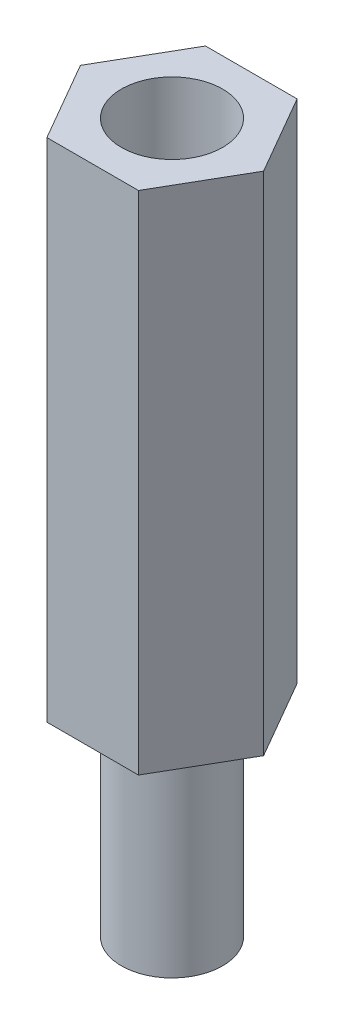
ISO-10303-21;
HEADER;
FILE_DESCRIPTION(('STEP AP214'),'2;1');
FILE_NAME('part.step','',(''),(''),'','','');
FILE_SCHEMA(('AUTOMOTIVE_DESIGN { 1 0 10303 214 1 1 1 1 }'));
ENDSEC;
DATA;
#1=APPLICATION_CONTEXT('core data for automotive mechanical design processes');
#2=APPLICATION_PROTOCOL_DEFINITION('international standard','automotive_design',2000,#1);
#3=PRODUCT_CONTEXT('',#1,'mechanical');
#4=PRODUCT('Part','Part','',(#3));
#5=PRODUCT_RELATED_PRODUCT_CATEGORY('part','',(#4));
#6=PRODUCT_DEFINITION_FORMATION('','',#4);
#7=PRODUCT_DEFINITION_CONTEXT('part definition',#1,'design');
#8=PRODUCT_DEFINITION('design','',#6,#7);
#9=PRODUCT_DEFINITION_SHAPE('','',#8);
#10=(LENGTH_UNIT() NAMED_UNIT(*) SI_UNIT(.MILLI.,.METRE.));
#11=(NAMED_UNIT(*) PLANE_ANGLE_UNIT() SI_UNIT($,.RADIAN.));
#12=(NAMED_UNIT(*) SI_UNIT($,.STERADIAN.) SOLID_ANGLE_UNIT());
#13=UNCERTAINTY_MEASURE_WITH_UNIT(LENGTH_MEASURE(1.E-05),#10,'distance_accuracy_value','');
#14=(GEOMETRIC_REPRESENTATION_CONTEXT(3) GLOBAL_UNCERTAINTY_ASSIGNED_CONTEXT((#13)) GLOBAL_UNIT_ASSIGNED_CONTEXT((#10,
#11,#12)) REPRESENTATION_CONTEXT('',''));
#15=CARTESIAN_POINT('',(0.,0.,0.));
#16=DIRECTION('',(0.,0.,1.));
#17=DIRECTION('',(1.,0.,0.));
#18=AXIS2_PLACEMENT_3D('',#15,#16,#17);
#19=CARTESIAN_POINT('',(0.,-6.,0.));
#20=DIRECTION('',(0.,1.,0.));
#21=DIRECTION('',(0.,0.,1.));
#22=AXIS2_PLACEMENT_3D('',#19,#20,#21);
#23=CYLINDRICAL_SURFACE('',#22,1.5);
#24=CARTESIAN_POINT('',(0.,-6.,0.));
#25=DIRECTION('',(0.,-1.,0.));
#26=DIRECTION('',(0.,0.,-1.));
#27=AXIS2_PLACEMENT_3D('',#24,#25,#26);
#28=CIRCLE('',#27,1.5);
#29=CARTESIAN_POINT('',(0.,-6.,-1.5));
#30=VERTEX_POINT('',#29);
#31=EDGE_CURVE('E11',#30,#30,#28,.T.);
#32=ORIENTED_EDGE('',*,*,#31,.F.);
#33=EDGE_LOOP('',(#32));
#34=FACE_BOUND('',#33,.T.);
#35=CARTESIAN_POINT('',(0.,0.,0.));
#36=DIRECTION('',(0.,-1.,0.));
#37=DIRECTION('',(0.,0.,-1.));
#38=AXIS2_PLACEMENT_3D('',#35,#36,#37);
#39=CIRCLE('',#38,1.5);
#40=CARTESIAN_POINT('',(0.,0.,-1.5));
#41=VERTEX_POINT('',#40);
#42=EDGE_CURVE('E46',#41,#41,#39,.T.);
#43=ORIENTED_EDGE('',*,*,#42,.T.);
#44=EDGE_LOOP('',(#43));
#45=FACE_BOUND('',#44,.T.);
#46=ADVANCED_FACE('F43',(#34,#45),#23,.T.);
#47=CARTESIAN_POINT('',(0.,-6.,0.));
#48=DIRECTION('',(0.,-1.,0.));
#49=DIRECTION('',(0.,0.,-1.));
#50=AXIS2_PLACEMENT_3D('',#47,#48,#49);
#51=PLANE('',#50);
#52=ORIENTED_EDGE('',*,*,#31,.T.);
#53=EDGE_LOOP('',(#52));
#54=FACE_BOUND('',#53,.T.);
#55=ADVANCED_FACE('F58',(#54),#51,.T.);
#56=CARTESIAN_POINT('',(0.,0.,0.));
#57=DIRECTION('',(0.,-1.,0.));
#58=DIRECTION('',(0.,0.,-1.));
#59=AXIS2_PLACEMENT_3D('',#56,#57,#58);
#60=PLANE('',#59);
#61=ORIENTED_EDGE('',*,*,#42,.F.);
#62=EDGE_LOOP('',(#61));
#63=FACE_BOUND('',#62,.T.);
#64=ADVANCED_FACE('F56',(#63),#60,.F.);
#65=CLOSED_SHELL('',(#46,#55,#64));
#66=MANIFOLD_SOLID_BREP('B2',#65);
#67=CARTESIAN_POINT('',(0.,15.,0.));
#68=DIRECTION('',(0.,1.,0.));
#69=DIRECTION('',(0.,0.,1.));
#70=AXIS2_PLACEMENT_3D('',#67,#68,#69);
#71=PLANE('',#70);
#72=DIRECTION('',(0.5,0.,-0.866025403784438));
#73=VECTOR('',#72,1.);
#74=CARTESIAN_POINT('',(1.35677313259562,15.,2.35));
#75=LINE('',#74,#73);
#76=CARTESIAN_POINT('',(1.35677313259562,15.,2.35));
#77=VERTEX_POINT('',#76);
#78=CARTESIAN_POINT('',(2.71354626519124,15.,0.));
#79=VERTEX_POINT('',#78);
#80=EDGE_CURVE('E180',#77,#79,#75,.T.);
#81=ORIENTED_EDGE('',*,*,#80,.T.);
#82=DIRECTION('',(-0.5,0.,-0.866025403784438));
#83=VECTOR('',#82,1.);
#84=CARTESIAN_POINT('',(2.71354626519124,15.,0.));
#85=LINE('',#84,#83);
#86=CARTESIAN_POINT('',(1.35677313259562,15.,-2.35));
#87=VERTEX_POINT('',#86);
#88=EDGE_CURVE('E138',#79,#87,#85,.T.);
#89=ORIENTED_EDGE('',*,*,#88,.T.);
#90=DIRECTION('',(-1.,0.,0.));
#91=VECTOR('',#90,1.);
#92=CARTESIAN_POINT('',(1.35677313259562,15.,-2.35));
#93=LINE('',#92,#91);
#94=CARTESIAN_POINT('',(-1.35677313259562,15.,-2.35));
#95=VERTEX_POINT('',#94);
#96=EDGE_CURVE('E151',#87,#95,#93,.T.);
#97=ORIENTED_EDGE('',*,*,#96,.T.);
#98=DIRECTION('',(-0.5,0.,0.866025403784439));
#99=VECTOR('',#98,1.);
#100=CARTESIAN_POINT('',(-1.35677313259562,15.,-2.35));
#101=LINE('',#100,#99);
#102=CARTESIAN_POINT('',(-2.71354626519124,15.,0.));
#103=VERTEX_POINT('',#102);
#104=EDGE_CURVE('E145',#95,#103,#101,.T.);
#105=ORIENTED_EDGE('',*,*,#104,.T.);
#106=DIRECTION('',(0.5,0.,0.866025403784438));
#107=VECTOR('',#106,1.);
#108=CARTESIAN_POINT('',(-2.71354626519124,15.,0.));
#109=LINE('',#108,#107);
#110=CARTESIAN_POINT('',(-1.35677313259562,15.,2.35));
#111=VERTEX_POINT('',#110);
#112=EDGE_CURVE('E149',#103,#111,#109,.T.);
#113=ORIENTED_EDGE('',*,*,#112,.T.);
#114=DIRECTION('',(1.,0.,0.));
#115=VECTOR('',#114,1.);
#116=CARTESIAN_POINT('',(-1.35677313259562,15.,2.35));
#117=LINE('',#116,#115);
#118=EDGE_CURVE('E101',#111,#77,#117,.T.);
#119=ORIENTED_EDGE('',*,*,#118,.T.);
#120=EDGE_LOOP('',(#81,#89,#97,#105,#113,#119));
#121=FACE_BOUND('',#120,.T.);
#122=CARTESIAN_POINT('',(0.,15.,0.));
#123=DIRECTION('',(0.,1.,0.));
#124=DIRECTION('',(0.,0.,1.));
#125=AXIS2_PLACEMENT_3D('',#122,#123,#124);
#126=CIRCLE('',#125,1.5);
#127=CARTESIAN_POINT('',(0.,15.,1.5));
#128=VERTEX_POINT('',#127);
#129=EDGE_CURVE('E173',#128,#128,#126,.T.);
#130=ORIENTED_EDGE('',*,*,#129,.F.);
#131=EDGE_LOOP('',(#130));
#132=FACE_BOUND('',#131,.T.);
#133=ADVANCED_FACE('F84',(#121,#132),#71,.T.);
#134=CARTESIAN_POINT('',(0.,0.,0.));
#135=DIRECTION('',(0.,1.,0.));
#136=DIRECTION('',(0.,0.,1.));
#137=AXIS2_PLACEMENT_3D('',#134,#135,#136);
#138=PLANE('',#137);
#139=DIRECTION('',(0.5,0.,-0.866025403784438));
#140=VECTOR('',#139,1.);
#141=CARTESIAN_POINT('',(1.35677313259562,0.,2.35));
#142=LINE('',#141,#140);
#143=CARTESIAN_POINT('',(1.35677313259562,0.,2.35));
#144=VERTEX_POINT('',#143);
#145=CARTESIAN_POINT('',(2.71354626519124,0.,0.));
#146=VERTEX_POINT('',#145);
#147=EDGE_CURVE('E169',#144,#146,#142,.T.);
#148=ORIENTED_EDGE('',*,*,#147,.F.);
#149=DIRECTION('',(1.,0.,0.));
#150=VECTOR('',#149,1.);
#151=CARTESIAN_POINT('',(-1.35677313259562,0.,2.35));
#152=LINE('',#151,#150);
#153=CARTESIAN_POINT('',(-1.35677313259562,0.,2.35));
#154=VERTEX_POINT('',#153);
#155=EDGE_CURVE('E130',#154,#144,#152,.T.);
#156=ORIENTED_EDGE('',*,*,#155,.F.);
#157=DIRECTION('',(0.5,0.,0.866025403784438));
#158=VECTOR('',#157,1.);
#159=CARTESIAN_POINT('',(-2.71354626519124,0.,0.));
#160=LINE('',#159,#158);
#161=CARTESIAN_POINT('',(-2.71354626519124,0.,0.));
#162=VERTEX_POINT('',#161);
#163=EDGE_CURVE('E124',#162,#154,#160,.T.);
#164=ORIENTED_EDGE('',*,*,#163,.F.);
#165=DIRECTION('',(-0.5,0.,0.866025403784439));
#166=VECTOR('',#165,1.);
#167=CARTESIAN_POINT('',(-1.35677313259562,0.,-2.35));
#168=LINE('',#167,#166);
#169=CARTESIAN_POINT('',(-1.35677313259562,0.,-2.35));
#170=VERTEX_POINT('',#169);
#171=EDGE_CURVE('E159',#170,#162,#168,.T.);
#172=ORIENTED_EDGE('',*,*,#171,.F.);
#173=DIRECTION('',(-1.,0.,0.));
#174=VECTOR('',#173,1.);
#175=CARTESIAN_POINT('',(1.35677313259562,0.,-2.35));
#176=LINE('',#175,#174);
#177=CARTESIAN_POINT('',(1.35677313259562,0.,-2.35));
#178=VERTEX_POINT('',#177);
#179=EDGE_CURVE('E175',#178,#170,#176,.T.);
#180=ORIENTED_EDGE('',*,*,#179,.F.);
#181=DIRECTION('',(-0.5,0.,-0.866025403784438));
#182=VECTOR('',#181,1.);
#183=CARTESIAN_POINT('',(2.71354626519124,0.,0.));
#184=LINE('',#183,#182);
#185=EDGE_CURVE('E172',#146,#178,#184,.T.);
#186=ORIENTED_EDGE('',*,*,#185,.F.);
#187=EDGE_LOOP('',(#148,#156,#164,#172,#180,#186));
#188=FACE_BOUND('',#187,.T.);
#189=CARTESIAN_POINT('',(0.,0.,0.));
#190=DIRECTION('',(0.,1.,0.));
#191=DIRECTION('',(0.,0.,1.));
#192=AXIS2_PLACEMENT_3D('',#189,#190,#191);
#193=CIRCLE('',#192,1.5);
#194=CARTESIAN_POINT('',(0.,0.,1.5));
#195=VERTEX_POINT('',#194);
#196=EDGE_CURVE('E273',#195,#195,#193,.T.);
#197=ORIENTED_EDGE('',*,*,#196,.T.);
#198=EDGE_LOOP('',(#197));
#199=FACE_BOUND('',#198,.T.);
#200=ADVANCED_FACE('F189',(#188,#199),#138,.F.);
#201=CARTESIAN_POINT('',(1.35677313259562,15.,2.35));
#202=DIRECTION('',(-0.866025403784439,0.,-0.5));
#203=DIRECTION('',(-0.5,0.,0.866025403784439));
#204=AXIS2_PLACEMENT_3D('',#201,#202,#203);
#205=PLANE('',#204);
#206=ORIENTED_EDGE('',*,*,#147,.T.);
#207=DIRECTION('',(0.,-1.,0.));
#208=VECTOR('',#207,1.);
#209=CARTESIAN_POINT('',(2.71354626519124,15.,0.));
#210=LINE('',#209,#208);
#211=EDGE_CURVE('E41',#79,#146,#210,.T.);
#212=ORIENTED_EDGE('',*,*,#211,.F.);
#213=ORIENTED_EDGE('',*,*,#80,.F.);
#214=DIRECTION('',(0.,-1.,0.));
#215=VECTOR('',#214,1.);
#216=CARTESIAN_POINT('',(1.35677313259562,15.,2.35));
#217=LINE('',#216,#215);
#218=EDGE_CURVE('E165',#77,#144,#217,.T.);
#219=ORIENTED_EDGE('',*,*,#218,.T.);
#220=EDGE_LOOP('',(#206,#212,#213,#219));
#221=FACE_BOUND('',#220,.T.);
#222=ADVANCED_FACE('F86',(#221),#205,.F.);
#223=CARTESIAN_POINT('',(2.71354626519124,15.,0.));
#224=DIRECTION('',(-0.866025403784438,0.,0.5));
#225=DIRECTION('',(0.5,0.,0.866025403784438));
#226=AXIS2_PLACEMENT_3D('',#223,#224,#225);
#227=PLANE('',#226);
#228=ORIENTED_EDGE('',*,*,#185,.T.);
#229=DIRECTION('',(0.,-1.,0.));
#230=VECTOR('',#229,1.);
#231=CARTESIAN_POINT('',(1.35677313259562,15.,-2.35));
#232=LINE('',#231,#230);
#233=EDGE_CURVE('E93',#87,#178,#232,.T.);
#234=ORIENTED_EDGE('',*,*,#233,.F.);
#235=ORIENTED_EDGE('',*,*,#88,.F.);
#236=ORIENTED_EDGE('',*,*,#211,.T.);
#237=EDGE_LOOP('',(#228,#234,#235,#236));
#238=FACE_BOUND('',#237,.T.);
#239=ADVANCED_FACE('F214',(#238),#227,.F.);
#240=CARTESIAN_POINT('',(1.35677313259562,15.,-2.35));
#241=DIRECTION('',(0.,0.,1.));
#242=DIRECTION('',(1.,0.,0.));
#243=AXIS2_PLACEMENT_3D('',#240,#241,#242);
#244=PLANE('',#243);
#245=ORIENTED_EDGE('',*,*,#179,.T.);
#246=DIRECTION('',(0.,-1.,0.));
#247=VECTOR('',#246,1.);
#248=CARTESIAN_POINT('',(-1.35677313259562,15.,-2.35));
#249=LINE('',#248,#247);
#250=EDGE_CURVE('E160',#95,#170,#249,.T.);
#251=ORIENTED_EDGE('',*,*,#250,.F.);
#252=ORIENTED_EDGE('',*,*,#96,.F.);
#253=ORIENTED_EDGE('',*,*,#233,.T.);
#254=EDGE_LOOP('',(#245,#251,#252,#253));
#255=FACE_BOUND('',#254,.T.);
#256=ADVANCED_FACE('F186',(#255),#244,.F.);
#257=CARTESIAN_POINT('',(-1.35677313259562,15.,-2.35));
#258=DIRECTION('',(0.866025403784439,0.,0.5));
#259=DIRECTION('',(0.5,0.,-0.866025403784439));
#260=AXIS2_PLACEMENT_3D('',#257,#258,#259);
#261=PLANE('',#260);
#262=ORIENTED_EDGE('',*,*,#171,.T.);
#263=DIRECTION('',(0.,-1.,0.));
#264=VECTOR('',#263,1.);
#265=CARTESIAN_POINT('',(-2.71354626519124,15.,0.));
#266=LINE('',#265,#264);
#267=EDGE_CURVE('E156',#103,#162,#266,.T.);
#268=ORIENTED_EDGE('',*,*,#267,.F.);
#269=ORIENTED_EDGE('',*,*,#104,.F.);
#270=ORIENTED_EDGE('',*,*,#250,.T.);
#271=EDGE_LOOP('',(#262,#268,#269,#270));
#272=FACE_BOUND('',#271,.T.);
#273=ADVANCED_FACE('F157',(#272),#261,.F.);
#274=CARTESIAN_POINT('',(-2.71354626519124,15.,0.));
#275=DIRECTION('',(0.866025403784438,0.,-0.5));
#276=DIRECTION('',(-0.5,0.,-0.866025403784439));
#277=AXIS2_PLACEMENT_3D('',#274,#275,#276);
#278=PLANE('',#277);
#279=ORIENTED_EDGE('',*,*,#163,.T.);
#280=DIRECTION('',(0.,-1.,0.));
#281=VECTOR('',#280,1.);
#282=CARTESIAN_POINT('',(-1.35677313259562,15.,2.35));
#283=LINE('',#282,#281);
#284=EDGE_CURVE('E161',#111,#154,#283,.T.);
#285=ORIENTED_EDGE('',*,*,#284,.F.);
#286=ORIENTED_EDGE('',*,*,#112,.F.);
#287=ORIENTED_EDGE('',*,*,#267,.T.);
#288=EDGE_LOOP('',(#279,#285,#286,#287));
#289=FACE_BOUND('',#288,.T.);
#290=ADVANCED_FACE('F163',(#289),#278,.F.);
#291=CARTESIAN_POINT('',(-1.35677313259562,15.,2.35));
#292=DIRECTION('',(0.,0.,-1.));
#293=DIRECTION('',(-1.,0.,0.));
#294=AXIS2_PLACEMENT_3D('',#291,#292,#293);
#295=PLANE('',#294);
#296=ORIENTED_EDGE('',*,*,#155,.T.);
#297=ORIENTED_EDGE('',*,*,#218,.F.);
#298=ORIENTED_EDGE('',*,*,#118,.F.);
#299=ORIENTED_EDGE('',*,*,#284,.T.);
#300=EDGE_LOOP('',(#296,#297,#298,#299));
#301=FACE_BOUND('',#300,.T.);
#302=ADVANCED_FACE('F194',(#301),#295,.F.);
#303=CARTESIAN_POINT('',(0.,15.,0.));
#304=DIRECTION('',(0.,-1.,0.));
#305=DIRECTION('',(0.,0.,-1.));
#306=AXIS2_PLACEMENT_3D('',#303,#304,#305);
#307=CYLINDRICAL_SURFACE('',#306,1.5);
#308=ORIENTED_EDGE('',*,*,#129,.T.);
#309=EDGE_LOOP('',(#308));
#310=FACE_BOUND('',#309,.T.);
#311=ORIENTED_EDGE('',*,*,#196,.F.);
#312=EDGE_LOOP('',(#311));
#313=FACE_BOUND('',#312,.T.);
#314=ADVANCED_FACE('F196',(#310,#313),#307,.F.);
#315=CLOSED_SHELL('',(#133,#200,#222,#239,#256,#273,#290,#302,#314));
#316=MANIFOLD_SOLID_BREP('B6',#315);
#317=ADVANCED_BREP_SHAPE_REPRESENTATION('',(#18,#66,#316),#14);
#318=SHAPE_DEFINITION_REPRESENTATION(#9,#317);
ENDSEC;
END-ISO-10303-21;
